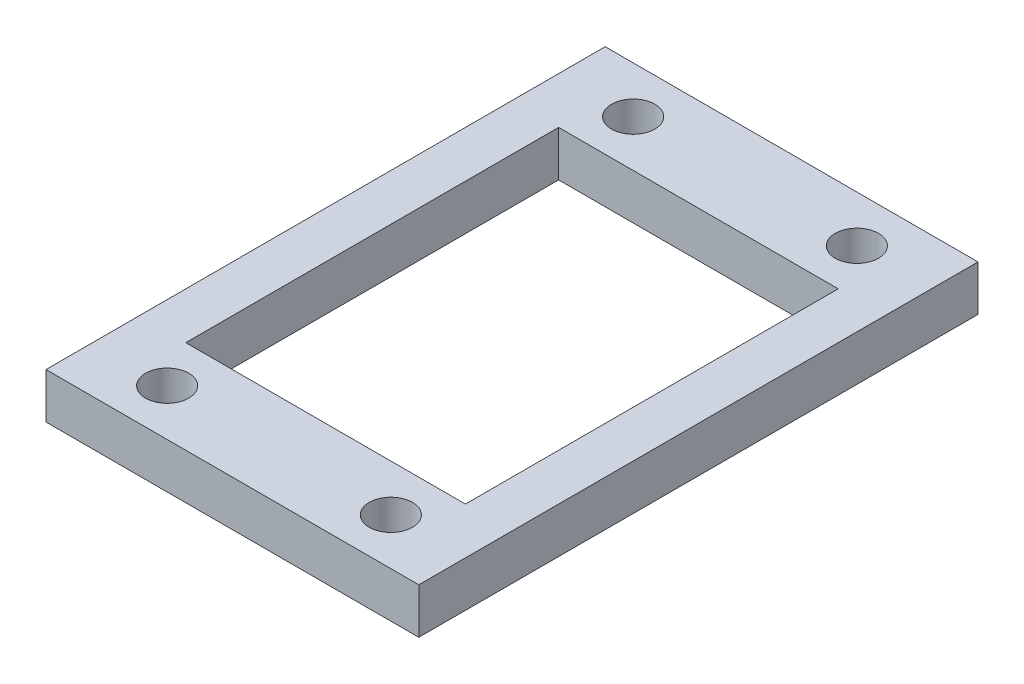
ISO-10303-21;
HEADER;
FILE_DESCRIPTION(('STEP AP214'),'2;1');
FILE_NAME('part.step','',(''),(''),'','','');
FILE_SCHEMA(('AUTOMOTIVE_DESIGN { 1 0 10303 214 1 1 1 1 }'));
ENDSEC;
DATA;
#1=APPLICATION_CONTEXT('core data for automotive mechanical design processes');
#2=APPLICATION_PROTOCOL_DEFINITION('international standard','automotive_design',2000,#1);
#3=PRODUCT_CONTEXT('',#1,'mechanical');
#4=PRODUCT('Part','Part','',(#3));
#5=PRODUCT_RELATED_PRODUCT_CATEGORY('part','',(#4));
#6=PRODUCT_DEFINITION_FORMATION('','',#4);
#7=PRODUCT_DEFINITION_CONTEXT('part definition',#1,'design');
#8=PRODUCT_DEFINITION('design','',#6,#7);
#9=PRODUCT_DEFINITION_SHAPE('','',#8);
#10=(LENGTH_UNIT() NAMED_UNIT(*) SI_UNIT(.MILLI.,.METRE.));
#11=(NAMED_UNIT(*) PLANE_ANGLE_UNIT() SI_UNIT($,.RADIAN.));
#12=(NAMED_UNIT(*) SI_UNIT($,.STERADIAN.) SOLID_ANGLE_UNIT());
#13=UNCERTAINTY_MEASURE_WITH_UNIT(LENGTH_MEASURE(1.E-05),#10,'distance_accuracy_value','');
#14=(GEOMETRIC_REPRESENTATION_CONTEXT(3) GLOBAL_UNCERTAINTY_ASSIGNED_CONTEXT((#13)) GLOBAL_UNIT_ASSIGNED_CONTEXT((#10,
#11,#12)) REPRESENTATION_CONTEXT('',''));
#15=CARTESIAN_POINT('',(0.,0.,0.));
#16=DIRECTION('',(0.,0.,1.));
#17=DIRECTION('',(1.,0.,0.));
#18=AXIS2_PLACEMENT_3D('',#15,#16,#17);
#19=CARTESIAN_POINT('',(-25.4,3.0988,19.05));
#20=DIRECTION('',(0.,1.,0.));
#21=DIRECTION('',(0.,0.,1.));
#22=AXIS2_PLACEMENT_3D('',#19,#20,#21);
#23=PLANE('',#22);
#24=CARTESIAN_POINT('',(-5.08000000000001,3.0988,15.875));
#25=DIRECTION('',(0.,1.,0.));
#26=DIRECTION('',(0.,0.,-1.));
#27=AXIS2_PLACEMENT_3D('',#24,#25,#26);
#28=CIRCLE('',#27,1.4732);
#29=CARTESIAN_POINT('',(-5.08000000000001,3.0988,14.4018));
#30=VERTEX_POINT('',#29);
#31=EDGE_CURVE('E162',#30,#30,#28,.T.);
#32=ORIENTED_EDGE('',*,*,#31,.F.);
#33=EDGE_LOOP('',(#32));
#34=FACE_BOUND('',#33,.T.);
#35=CARTESIAN_POINT('',(-20.32,3.0988,15.875));
#36=DIRECTION('',(0.,1.,0.));
#37=DIRECTION('',(0.,0.,1.));
#38=AXIS2_PLACEMENT_3D('',#35,#36,#37);
#39=CIRCLE('',#38,1.4732);
#40=CARTESIAN_POINT('',(-20.32,3.0988,17.3482));
#41=VERTEX_POINT('',#40);
#42=EDGE_CURVE('E177',#41,#41,#39,.T.);
#43=ORIENTED_EDGE('',*,*,#42,.F.);
#44=EDGE_LOOP('',(#43));
#45=FACE_BOUND('',#44,.T.);
#46=DIRECTION('',(0.,0.,1.));
#47=VECTOR('',#46,1.);
#48=CARTESIAN_POINT('',(-25.4,3.0988,-19.05));
#49=LINE('',#48,#47);
#50=CARTESIAN_POINT('',(-25.4,3.0988,-19.05));
#51=VERTEX_POINT('',#50);
#52=CARTESIAN_POINT('',(-25.4,3.0988,19.05));
#53=VERTEX_POINT('',#52);
#54=EDGE_CURVE('E191',#51,#53,#49,.T.);
#55=ORIENTED_EDGE('',*,*,#54,.T.);
#56=DIRECTION('',(1.,0.,0.));
#57=VECTOR('',#56,1.);
#58=CARTESIAN_POINT('',(-25.4,3.0988,19.05));
#59=LINE('',#58,#57);
#60=CARTESIAN_POINT('',(0.,3.0988,19.05));
#61=VERTEX_POINT('',#60);
#62=EDGE_CURVE('E195',#53,#61,#59,.T.);
#63=ORIENTED_EDGE('',*,*,#62,.T.);
#64=DIRECTION('',(0.,0.,-1.));
#65=VECTOR('',#64,1.);
#66=CARTESIAN_POINT('',(0.,3.0988,-19.05));
#67=LINE('',#66,#65);
#68=CARTESIAN_POINT('',(0.,3.0988,-19.05));
#69=VERTEX_POINT('',#68);
#70=EDGE_CURVE('E199',#61,#69,#67,.T.);
#71=ORIENTED_EDGE('',*,*,#70,.T.);
#72=DIRECTION('',(-1.,0.,0.));
#73=VECTOR('',#72,1.);
#74=CARTESIAN_POINT('',(-25.4,3.0988,-19.05));
#75=LINE('',#74,#73);
#76=EDGE_CURVE('E202',#69,#51,#75,.T.);
#77=ORIENTED_EDGE('',*,*,#76,.T.);
#78=EDGE_LOOP('',(#55,#63,#71,#77));
#79=FACE_BOUND('',#78,.T.);
#80=CARTESIAN_POINT('',(-5.08000000000001,3.0988,-15.875));
#81=DIRECTION('',(0.,1.,0.));
#82=DIRECTION('',(0.,0.,1.));
#83=AXIS2_PLACEMENT_3D('',#80,#81,#82);
#84=CIRCLE('',#83,1.4732);
#85=CARTESIAN_POINT('',(-5.08000000000001,3.0988,-14.4018));
#86=VERTEX_POINT('',#85);
#87=EDGE_CURVE('E185',#86,#86,#84,.T.);
#88=ORIENTED_EDGE('',*,*,#87,.F.);
#89=EDGE_LOOP('',(#88));
#90=FACE_BOUND('',#89,.T.);
#91=CARTESIAN_POINT('',(-20.32,3.0988,-15.875));
#92=DIRECTION('',(0.,1.,0.));
#93=DIRECTION('',(0.,0.,-1.));
#94=AXIS2_PLACEMENT_3D('',#91,#92,#93);
#95=CIRCLE('',#94,1.4732);
#96=CARTESIAN_POINT('',(-20.32,3.0988,-17.3482));
#97=VERTEX_POINT('',#96);
#98=EDGE_CURVE('E170',#97,#97,#95,.T.);
#99=ORIENTED_EDGE('',*,*,#98,.F.);
#100=EDGE_LOOP('',(#99));
#101=FACE_BOUND('',#100,.T.);
#102=DIRECTION('',(-1.,0.,0.));
#103=VECTOR('',#102,1.);
#104=CARTESIAN_POINT('',(-22.225,3.0988,-12.7));
#105=LINE('',#104,#103);
#106=CARTESIAN_POINT('',(-3.17500000000001,3.0988,-12.7));
#107=VERTEX_POINT('',#106);
#108=CARTESIAN_POINT('',(-22.225,3.0988,-12.7));
#109=VERTEX_POINT('',#108);
#110=EDGE_CURVE('E123',#107,#109,#105,.T.);
#111=ORIENTED_EDGE('',*,*,#110,.F.);
#112=DIRECTION('',(0.,0.,-1.));
#113=VECTOR('',#112,1.);
#114=CARTESIAN_POINT('',(-3.175,3.0988,12.7));
#115=LINE('',#114,#113);
#116=CARTESIAN_POINT('',(-3.175,3.0988,12.7));
#117=VERTEX_POINT('',#116);
#118=EDGE_CURVE('E114',#117,#107,#115,.T.);
#119=ORIENTED_EDGE('',*,*,#118,.F.);
#120=DIRECTION('',(1.,0.,0.));
#121=VECTOR('',#120,1.);
#122=CARTESIAN_POINT('',(-22.225,3.0988,12.7));
#123=LINE('',#122,#121);
#124=CARTESIAN_POINT('',(-22.225,3.0988,12.7));
#125=VERTEX_POINT('',#124);
#126=EDGE_CURVE('E141',#125,#117,#123,.T.);
#127=ORIENTED_EDGE('',*,*,#126,.F.);
#128=DIRECTION('',(0.,0.,1.));
#129=VECTOR('',#128,1.);
#130=CARTESIAN_POINT('',(-22.225,3.0988,12.7));
#131=LINE('',#130,#129);
#132=EDGE_CURVE('E135',#109,#125,#131,.T.);
#133=ORIENTED_EDGE('',*,*,#132,.F.);
#134=EDGE_LOOP('',(#111,#119,#127,#133));
#135=FACE_BOUND('',#134,.T.);
#136=ADVANCED_FACE('F38',(#34,#45,#79,#90,#101,#135),#23,.T.);
#137=CARTESIAN_POINT('',(-25.4,0.,19.05));
#138=DIRECTION('',(0.,1.,0.));
#139=DIRECTION('',(0.,0.,1.));
#140=AXIS2_PLACEMENT_3D('',#137,#138,#139);
#141=PLANE('',#140);
#142=CARTESIAN_POINT('',(-5.08000000000001,0.,15.875));
#143=DIRECTION('',(0.,1.,0.));
#144=DIRECTION('',(0.,0.,-1.));
#145=AXIS2_PLACEMENT_3D('',#142,#143,#144);
#146=CIRCLE('',#145,1.4732);
#147=CARTESIAN_POINT('',(-5.08000000000001,0.,14.4018));
#148=VERTEX_POINT('',#147);
#149=EDGE_CURVE('E131',#148,#148,#146,.T.);
#150=ORIENTED_EDGE('',*,*,#149,.T.);
#151=EDGE_LOOP('',(#150));
#152=FACE_BOUND('',#151,.T.);
#153=CARTESIAN_POINT('',(-20.32,0.,15.875));
#154=DIRECTION('',(0.,1.,0.));
#155=DIRECTION('',(0.,0.,1.));
#156=AXIS2_PLACEMENT_3D('',#153,#154,#155);
#157=CIRCLE('',#156,1.4732);
#158=CARTESIAN_POINT('',(-20.32,0.,17.3482));
#159=VERTEX_POINT('',#158);
#160=EDGE_CURVE('E174',#159,#159,#157,.T.);
#161=ORIENTED_EDGE('',*,*,#160,.T.);
#162=EDGE_LOOP('',(#161));
#163=FACE_BOUND('',#162,.T.);
#164=DIRECTION('',(0.,0.,1.));
#165=VECTOR('',#164,1.);
#166=CARTESIAN_POINT('',(-25.4,0.,-19.05));
#167=LINE('',#166,#165);
#168=CARTESIAN_POINT('',(-25.4,0.,-19.05));
#169=VERTEX_POINT('',#168);
#170=CARTESIAN_POINT('',(-25.4,0.,19.05));
#171=VERTEX_POINT('',#170);
#172=EDGE_CURVE('E188',#169,#171,#167,.T.);
#173=ORIENTED_EDGE('',*,*,#172,.F.);
#174=DIRECTION('',(-1.,0.,0.));
#175=VECTOR('',#174,1.);
#176=CARTESIAN_POINT('',(-25.4,0.,-19.05));
#177=LINE('',#176,#175);
#178=CARTESIAN_POINT('',(0.,0.,-19.05));
#179=VERTEX_POINT('',#178);
#180=EDGE_CURVE('E196',#179,#169,#177,.T.);
#181=ORIENTED_EDGE('',*,*,#180,.F.);
#182=DIRECTION('',(0.,0.,-1.));
#183=VECTOR('',#182,1.);
#184=CARTESIAN_POINT('',(0.,0.,-19.05));
#185=LINE('',#184,#183);
#186=CARTESIAN_POINT('',(0.,0.,19.05));
#187=VERTEX_POINT('',#186);
#188=EDGE_CURVE('E212',#187,#179,#185,.T.);
#189=ORIENTED_EDGE('',*,*,#188,.F.);
#190=DIRECTION('',(1.,0.,0.));
#191=VECTOR('',#190,1.);
#192=CARTESIAN_POINT('',(-25.4,0.,19.05));
#193=LINE('',#192,#191);
#194=EDGE_CURVE('E209',#171,#187,#193,.T.);
#195=ORIENTED_EDGE('',*,*,#194,.F.);
#196=EDGE_LOOP('',(#173,#181,#189,#195));
#197=FACE_BOUND('',#196,.T.);
#198=CARTESIAN_POINT('',(-5.08000000000001,0.,-15.875));
#199=DIRECTION('',(0.,1.,0.));
#200=DIRECTION('',(0.,0.,1.));
#201=AXIS2_PLACEMENT_3D('',#198,#199,#200);
#202=CIRCLE('',#201,1.4732);
#203=CARTESIAN_POINT('',(-5.08000000000001,0.,-14.4018));
#204=VERTEX_POINT('',#203);
#205=EDGE_CURVE('E181',#204,#204,#202,.T.);
#206=ORIENTED_EDGE('',*,*,#205,.T.);
#207=EDGE_LOOP('',(#206));
#208=FACE_BOUND('',#207,.T.);
#209=CARTESIAN_POINT('',(-20.32,0.,-15.875));
#210=DIRECTION('',(0.,1.,0.));
#211=DIRECTION('',(0.,0.,-1.));
#212=AXIS2_PLACEMENT_3D('',#209,#210,#211);
#213=CIRCLE('',#212,1.4732);
#214=CARTESIAN_POINT('',(-20.32,0.,-17.3482));
#215=VERTEX_POINT('',#214);
#216=EDGE_CURVE('E166',#215,#215,#213,.T.);
#217=ORIENTED_EDGE('',*,*,#216,.T.);
#218=EDGE_LOOP('',(#217));
#219=FACE_BOUND('',#218,.T.);
#220=DIRECTION('',(0.,0.,-1.));
#221=VECTOR('',#220,1.);
#222=CARTESIAN_POINT('',(-3.175,0.,12.7));
#223=LINE('',#222,#221);
#224=CARTESIAN_POINT('',(-3.175,0.,12.7));
#225=VERTEX_POINT('',#224);
#226=CARTESIAN_POINT('',(-3.17500000000001,0.,-12.7));
#227=VERTEX_POINT('',#226);
#228=EDGE_CURVE('E67',#225,#227,#223,.T.);
#229=ORIENTED_EDGE('',*,*,#228,.T.);
#230=DIRECTION('',(-1.,0.,0.));
#231=VECTOR('',#230,1.);
#232=CARTESIAN_POINT('',(-22.225,0.,-12.7));
#233=LINE('',#232,#231);
#234=CARTESIAN_POINT('',(-22.225,0.,-12.7));
#235=VERTEX_POINT('',#234);
#236=EDGE_CURVE('E130',#227,#235,#233,.T.);
#237=ORIENTED_EDGE('',*,*,#236,.T.);
#238=DIRECTION('',(0.,0.,1.));
#239=VECTOR('',#238,1.);
#240=CARTESIAN_POINT('',(-22.225,0.,12.7));
#241=LINE('',#240,#239);
#242=CARTESIAN_POINT('',(-22.225,0.,12.7));
#243=VERTEX_POINT('',#242);
#244=EDGE_CURVE('E149',#235,#243,#241,.T.);
#245=ORIENTED_EDGE('',*,*,#244,.T.);
#246=DIRECTION('',(1.,0.,0.));
#247=VECTOR('',#246,1.);
#248=CARTESIAN_POINT('',(-22.225,0.,12.7));
#249=LINE('',#248,#247);
#250=EDGE_CURVE('E124',#243,#225,#249,.T.);
#251=ORIENTED_EDGE('',*,*,#250,.T.);
#252=EDGE_LOOP('',(#229,#237,#245,#251));
#253=FACE_BOUND('',#252,.T.);
#254=ADVANCED_FACE('F233',(#152,#163,#197,#208,#219,#253),#141,.F.);
#255=CARTESIAN_POINT('',(-25.4,3.0988,-19.05));
#256=DIRECTION('',(1.,0.,0.));
#257=DIRECTION('',(0.,0.,-1.));
#258=AXIS2_PLACEMENT_3D('',#255,#256,#257);
#259=PLANE('',#258);
#260=ORIENTED_EDGE('',*,*,#172,.T.);
#261=DIRECTION('',(0.,-1.,0.));
#262=VECTOR('',#261,1.);
#263=CARTESIAN_POINT('',(-25.4,3.0988,19.05));
#264=LINE('',#263,#262);
#265=EDGE_CURVE('E11',#53,#171,#264,.T.);
#266=ORIENTED_EDGE('',*,*,#265,.F.);
#267=ORIENTED_EDGE('',*,*,#54,.F.);
#268=DIRECTION('',(0.,-1.,0.));
#269=VECTOR('',#268,1.);
#270=CARTESIAN_POINT('',(-25.4,3.0988,-19.05));
#271=LINE('',#270,#269);
#272=EDGE_CURVE('E205',#51,#169,#271,.T.);
#273=ORIENTED_EDGE('',*,*,#272,.T.);
#274=EDGE_LOOP('',(#260,#266,#267,#273));
#275=FACE_BOUND('',#274,.T.);
#276=ADVANCED_FACE('F40',(#275),#259,.F.);
#277=CARTESIAN_POINT('',(-25.4,3.0988,19.05));
#278=DIRECTION('',(0.,0.,-1.));
#279=DIRECTION('',(-1.,0.,0.));
#280=AXIS2_PLACEMENT_3D('',#277,#278,#279);
#281=PLANE('',#280);
#282=ORIENTED_EDGE('',*,*,#194,.T.);
#283=DIRECTION('',(0.,-1.,0.));
#284=VECTOR('',#283,1.);
#285=CARTESIAN_POINT('',(0.,3.0988,19.05));
#286=LINE('',#285,#284);
#287=EDGE_CURVE('E47',#61,#187,#286,.T.);
#288=ORIENTED_EDGE('',*,*,#287,.F.);
#289=ORIENTED_EDGE('',*,*,#62,.F.);
#290=ORIENTED_EDGE('',*,*,#265,.T.);
#291=EDGE_LOOP('',(#282,#288,#289,#290));
#292=FACE_BOUND('',#291,.T.);
#293=ADVANCED_FACE('F244',(#292),#281,.F.);
#294=CARTESIAN_POINT('',(0.,3.0988,-19.05));
#295=DIRECTION('',(-1.,0.,0.));
#296=DIRECTION('',(0.,0.,1.));
#297=AXIS2_PLACEMENT_3D('',#294,#295,#296);
#298=PLANE('',#297);
#299=ORIENTED_EDGE('',*,*,#188,.T.);
#300=DIRECTION('',(0.,-1.,0.));
#301=VECTOR('',#300,1.);
#302=CARTESIAN_POINT('',(0.,3.0988,-19.05));
#303=LINE('',#302,#301);
#304=EDGE_CURVE('E219',#69,#179,#303,.T.);
#305=ORIENTED_EDGE('',*,*,#304,.F.);
#306=ORIENTED_EDGE('',*,*,#70,.F.);
#307=ORIENTED_EDGE('',*,*,#287,.T.);
#308=EDGE_LOOP('',(#299,#305,#306,#307));
#309=FACE_BOUND('',#308,.T.);
#310=ADVANCED_FACE('F227',(#309),#298,.F.);
#311=CARTESIAN_POINT('',(-25.4,3.0988,-19.05));
#312=DIRECTION('',(0.,0.,1.));
#313=DIRECTION('',(1.,0.,0.));
#314=AXIS2_PLACEMENT_3D('',#311,#312,#313);
#315=PLANE('',#314);
#316=ORIENTED_EDGE('',*,*,#180,.T.);
#317=ORIENTED_EDGE('',*,*,#272,.F.);
#318=ORIENTED_EDGE('',*,*,#76,.F.);
#319=ORIENTED_EDGE('',*,*,#304,.T.);
#320=EDGE_LOOP('',(#316,#317,#318,#319));
#321=FACE_BOUND('',#320,.T.);
#322=ADVANCED_FACE('F237',(#321),#315,.F.);
#323=CARTESIAN_POINT('',(-5.08000000000001,3.0988,-15.875));
#324=DIRECTION('',(0.,-1.,0.));
#325=DIRECTION('',(0.,0.,-1.));
#326=AXIS2_PLACEMENT_3D('',#323,#324,#325);
#327=CYLINDRICAL_SURFACE('',#326,1.4732);
#328=ORIENTED_EDGE('',*,*,#87,.T.);
#329=EDGE_LOOP('',(#328));
#330=FACE_BOUND('',#329,.T.);
#331=ORIENTED_EDGE('',*,*,#205,.F.);
#332=EDGE_LOOP('',(#331));
#333=FACE_BOUND('',#332,.T.);
#334=ADVANCED_FACE('F262',(#330,#333),#327,.F.);
#335=CARTESIAN_POINT('',(-20.32,3.0988,15.875));
#336=DIRECTION('',(0.,-1.,0.));
#337=DIRECTION('',(0.,0.,-1.));
#338=AXIS2_PLACEMENT_3D('',#335,#336,#337);
#339=CYLINDRICAL_SURFACE('',#338,1.4732);
#340=ORIENTED_EDGE('',*,*,#42,.T.);
#341=EDGE_LOOP('',(#340));
#342=FACE_BOUND('',#341,.T.);
#343=ORIENTED_EDGE('',*,*,#160,.F.);
#344=EDGE_LOOP('',(#343));
#345=FACE_BOUND('',#344,.T.);
#346=ADVANCED_FACE('F269',(#342,#345),#339,.F.);
#347=CARTESIAN_POINT('',(-20.32,3.0988,-15.875));
#348=DIRECTION('',(0.,-1.,0.));
#349=DIRECTION('',(0.,0.,-1.));
#350=AXIS2_PLACEMENT_3D('',#347,#348,#349);
#351=CYLINDRICAL_SURFACE('',#350,1.4732);
#352=ORIENTED_EDGE('',*,*,#98,.T.);
#353=EDGE_LOOP('',(#352));
#354=FACE_BOUND('',#353,.T.);
#355=ORIENTED_EDGE('',*,*,#216,.F.);
#356=EDGE_LOOP('',(#355));
#357=FACE_BOUND('',#356,.T.);
#358=ADVANCED_FACE('F274',(#354,#357),#351,.F.);
#359=CARTESIAN_POINT('',(-5.08000000000001,3.0988,15.875));
#360=DIRECTION('',(0.,-1.,0.));
#361=DIRECTION('',(0.,0.,-1.));
#362=AXIS2_PLACEMENT_3D('',#359,#360,#361);
#363=CYLINDRICAL_SURFACE('',#362,1.4732);
#364=ORIENTED_EDGE('',*,*,#31,.T.);
#365=EDGE_LOOP('',(#364));
#366=FACE_BOUND('',#365,.T.);
#367=ORIENTED_EDGE('',*,*,#149,.F.);
#368=EDGE_LOOP('',(#367));
#369=FACE_BOUND('',#368,.T.);
#370=ADVANCED_FACE('F297',(#366,#369),#363,.F.);
#371=CARTESIAN_POINT('',(-3.175,3.0988,12.7));
#372=DIRECTION('',(-1.,0.,0.));
#373=DIRECTION('',(0.,0.,1.));
#374=AXIS2_PLACEMENT_3D('',#371,#372,#373);
#375=PLANE('',#374);
#376=ORIENTED_EDGE('',*,*,#228,.F.);
#377=DIRECTION('',(0.,-1.,0.));
#378=VECTOR('',#377,1.);
#379=CARTESIAN_POINT('',(-3.175,3.0988,12.7));
#380=LINE('',#379,#378);
#381=EDGE_CURVE('E118',#117,#225,#380,.T.);
#382=ORIENTED_EDGE('',*,*,#381,.F.);
#383=ORIENTED_EDGE('',*,*,#118,.T.);
#384=DIRECTION('',(0.,-1.,0.));
#385=VECTOR('',#384,1.);
#386=CARTESIAN_POINT('',(-3.17500000000001,3.0988,-12.7));
#387=LINE('',#386,#385);
#388=EDGE_CURVE('E117',#107,#227,#387,.T.);
#389=ORIENTED_EDGE('',*,*,#388,.T.);
#390=EDGE_LOOP('',(#376,#382,#383,#389));
#391=FACE_BOUND('',#390,.T.);
#392=ADVANCED_FACE('F116',(#391),#375,.T.);
#393=CARTESIAN_POINT('',(-22.225,3.0988,-12.7));
#394=DIRECTION('',(0.,0.,1.));
#395=DIRECTION('',(1.,0.,0.));
#396=AXIS2_PLACEMENT_3D('',#393,#394,#395);
#397=PLANE('',#396);
#398=ORIENTED_EDGE('',*,*,#236,.F.);
#399=ORIENTED_EDGE('',*,*,#388,.F.);
#400=ORIENTED_EDGE('',*,*,#110,.T.);
#401=DIRECTION('',(0.,-1.,0.));
#402=VECTOR('',#401,1.);
#403=CARTESIAN_POINT('',(-22.225,3.0988,-12.7));
#404=LINE('',#403,#402);
#405=EDGE_CURVE('E132',#109,#235,#404,.T.);
#406=ORIENTED_EDGE('',*,*,#405,.T.);
#407=EDGE_LOOP('',(#398,#399,#400,#406));
#408=FACE_BOUND('',#407,.T.);
#409=ADVANCED_FACE('F127',(#408),#397,.T.);
#410=CARTESIAN_POINT('',(-22.225,3.0988,12.7));
#411=DIRECTION('',(1.,0.,0.));
#412=DIRECTION('',(0.,0.,-1.));
#413=AXIS2_PLACEMENT_3D('',#410,#411,#412);
#414=PLANE('',#413);
#415=ORIENTED_EDGE('',*,*,#244,.F.);
#416=ORIENTED_EDGE('',*,*,#405,.F.);
#417=ORIENTED_EDGE('',*,*,#132,.T.);
#418=DIRECTION('',(0.,-1.,0.));
#419=VECTOR('',#418,1.);
#420=CARTESIAN_POINT('',(-22.225,3.0988,12.7));
#421=LINE('',#420,#419);
#422=EDGE_CURVE('E57',#125,#243,#421,.T.);
#423=ORIENTED_EDGE('',*,*,#422,.T.);
#424=EDGE_LOOP('',(#415,#416,#417,#423));
#425=FACE_BOUND('',#424,.T.);
#426=ADVANCED_FACE('F285',(#425),#414,.T.);
#427=CARTESIAN_POINT('',(-22.225,3.0988,12.7));
#428=DIRECTION('',(0.,0.,-1.));
#429=DIRECTION('',(-1.,0.,0.));
#430=AXIS2_PLACEMENT_3D('',#427,#428,#429);
#431=PLANE('',#430);
#432=ORIENTED_EDGE('',*,*,#250,.F.);
#433=ORIENTED_EDGE('',*,*,#422,.F.);
#434=ORIENTED_EDGE('',*,*,#126,.T.);
#435=ORIENTED_EDGE('',*,*,#381,.T.);
#436=EDGE_LOOP('',(#432,#433,#434,#435));
#437=FACE_BOUND('',#436,.T.);
#438=ADVANCED_FACE('F283',(#437),#431,.T.);
#439=CLOSED_SHELL('',(#136,#254,#276,#293,#310,#322,#334,#346,#358,#370,#392,#409,#426,#438));
#440=MANIFOLD_SOLID_BREP('B2',#439);
#441=ADVANCED_BREP_SHAPE_REPRESENTATION('',(#18,#440),#14);
#442=SHAPE_DEFINITION_REPRESENTATION(#9,#441);
ENDSEC;
END-ISO-10303-21;
